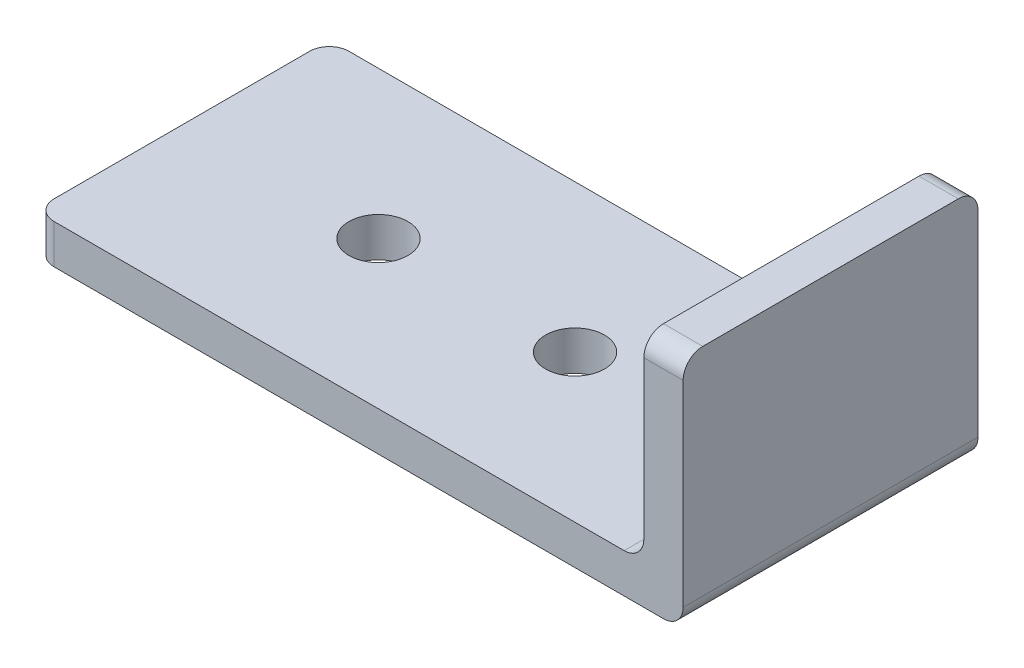
ISO-10303-21;
HEADER;
FILE_DESCRIPTION(('STEP AP214'),'2;1');
FILE_NAME('part.step','',(''),(''),'','','');
FILE_SCHEMA(('AUTOMOTIVE_DESIGN { 1 0 10303 214 1 1 1 1 }'));
ENDSEC;
DATA;
#1=APPLICATION_CONTEXT('core data for automotive mechanical design processes');
#2=APPLICATION_PROTOCOL_DEFINITION('international standard','automotive_design',2000,#1);
#3=PRODUCT_CONTEXT('',#1,'mechanical');
#4=PRODUCT('Part','Part','',(#3));
#5=PRODUCT_RELATED_PRODUCT_CATEGORY('part','',(#4));
#6=PRODUCT_DEFINITION_FORMATION('','',#4);
#7=PRODUCT_DEFINITION_CONTEXT('part definition',#1,'design');
#8=PRODUCT_DEFINITION('design','',#6,#7);
#9=PRODUCT_DEFINITION_SHAPE('','',#8);
#10=(LENGTH_UNIT() NAMED_UNIT(*) SI_UNIT(.MILLI.,.METRE.));
#11=(NAMED_UNIT(*) PLANE_ANGLE_UNIT() SI_UNIT($,.RADIAN.));
#12=(NAMED_UNIT(*) SI_UNIT($,.STERADIAN.) SOLID_ANGLE_UNIT());
#13=UNCERTAINTY_MEASURE_WITH_UNIT(LENGTH_MEASURE(1.E-05),#10,'distance_accuracy_value','');
#14=(GEOMETRIC_REPRESENTATION_CONTEXT(3) GLOBAL_UNCERTAINTY_ASSIGNED_CONTEXT((#13)) GLOBAL_UNIT_ASSIGNED_CONTEXT((#10,
#11,#12)) REPRESENTATION_CONTEXT('',''));
#15=CARTESIAN_POINT('',(0.,0.,0.));
#16=DIRECTION('',(0.,0.,1.));
#17=DIRECTION('',(1.,0.,0.));
#18=AXIS2_PLACEMENT_3D('',#15,#16,#17);
#19=CARTESIAN_POINT('',(0.,2.,-15.));
#20=DIRECTION('',(0.,0.,-1.));
#21=DIRECTION('',(-1.,0.,0.));
#22=AXIS2_PLACEMENT_3D('',#19,#20,#21);
#23=PLANE('',#22);
#24=DIRECTION('',(0.,-1.,0.));
#25=VECTOR('',#24,1.);
#26=CARTESIAN_POINT('',(33.,2.,-15.));
#27=LINE('',#26,#25);
#28=CARTESIAN_POINT('',(33.,11.,-15.));
#29=VERTEX_POINT('',#28);
#30=CARTESIAN_POINT('',(33.,1.,-15.));
#31=VERTEX_POINT('',#30);
#32=EDGE_CURVE('E199',#29,#31,#27,.T.);
#33=ORIENTED_EDGE('',*,*,#32,.T.);
#34=CARTESIAN_POINT('',(32.,1.,-15.));
#35=DIRECTION('',(0.,0.,-1.));
#36=DIRECTION('',(-1.,0.,0.));
#37=AXIS2_PLACEMENT_3D('',#34,#35,#36);
#38=CIRCLE('',#37,1.);
#39=CARTESIAN_POINT('',(32.,0.,-15.));
#40=VERTEX_POINT('',#39);
#41=EDGE_CURVE('E59',#31,#40,#38,.T.);
#42=ORIENTED_EDGE('',*,*,#41,.T.);
#43=DIRECTION('',(1.,0.,0.));
#44=VECTOR('',#43,1.);
#45=CARTESIAN_POINT('',(0.,0.,-15.));
#46=LINE('',#45,#44);
#47=CARTESIAN_POINT('',(1.,0.,-15.));
#48=VERTEX_POINT('',#47);
#49=EDGE_CURVE('E217',#48,#40,#46,.T.);
#50=ORIENTED_EDGE('',*,*,#49,.F.);
#51=DIRECTION('',(0.,-1.,0.));
#52=VECTOR('',#51,1.);
#53=CARTESIAN_POINT('',(1.,2.,-15.));
#54=LINE('',#53,#52);
#55=CARTESIAN_POINT('',(1.,2.,-15.));
#56=VERTEX_POINT('',#55);
#57=EDGE_CURVE('E135',#48,#56,#54,.F.);
#58=ORIENTED_EDGE('',*,*,#57,.T.);
#59=DIRECTION('',(1.,0.,0.));
#60=VECTOR('',#59,1.);
#61=CARTESIAN_POINT('',(0.,2.,-15.));
#62=LINE('',#61,#60);
#63=CARTESIAN_POINT('',(30.,2.,-15.));
#64=VERTEX_POINT('',#63);
#65=EDGE_CURVE('E227',#56,#64,#62,.T.);
#66=ORIENTED_EDGE('',*,*,#65,.T.);
#67=CARTESIAN_POINT('',(30.,3.,-15.));
#68=DIRECTION('',(0.,0.,-1.));
#69=DIRECTION('',(-1.,0.,0.));
#70=AXIS2_PLACEMENT_3D('',#67,#68,#69);
#71=CIRCLE('',#70,1.);
#72=CARTESIAN_POINT('',(31.,3.,-15.));
#73=VERTEX_POINT('',#72);
#74=EDGE_CURVE('E190',#64,#73,#71,.F.);
#75=ORIENTED_EDGE('',*,*,#74,.T.);
#76=DIRECTION('',(0.,-1.,0.));
#77=VECTOR('',#76,1.);
#78=CARTESIAN_POINT('',(31.,12.,-15.));
#79=LINE('',#78,#77);
#80=CARTESIAN_POINT('',(31.,11.,-15.));
#81=VERTEX_POINT('',#80);
#82=EDGE_CURVE('E147',#81,#73,#79,.T.);
#83=ORIENTED_EDGE('',*,*,#82,.F.);
#84=DIRECTION('',(-1.,0.,0.));
#85=VECTOR('',#84,1.);
#86=CARTESIAN_POINT('',(33.,11.,-15.));
#87=LINE('',#86,#85);
#88=EDGE_CURVE('E177',#81,#29,#87,.F.);
#89=ORIENTED_EDGE('',*,*,#88,.T.);
#90=EDGE_LOOP('',(#33,#42,#50,#58,#66,#75,#83,#89));
#91=FACE_BOUND('',#90,.T.);
#92=ADVANCED_FACE('F37',(#91),#23,.T.);
#93=CARTESIAN_POINT('',(0.,2.,0.));
#94=DIRECTION('',(-1.,0.,0.));
#95=DIRECTION('',(0.,0.,1.));
#96=AXIS2_PLACEMENT_3D('',#93,#94,#95);
#97=PLANE('',#96);
#98=DIRECTION('',(0.,0.,-1.));
#99=VECTOR('',#98,1.);
#100=CARTESIAN_POINT('',(0.,0.,0.));
#101=LINE('',#100,#99);
#102=CARTESIAN_POINT('',(0.,0.,-1.));
#103=VERTEX_POINT('',#102);
#104=CARTESIAN_POINT('',(0.,0.,-14.));
#105=VERTEX_POINT('',#104);
#106=EDGE_CURVE('E214',#103,#105,#101,.T.);
#107=ORIENTED_EDGE('',*,*,#106,.F.);
#108=DIRECTION('',(0.,-1.,0.));
#109=VECTOR('',#108,1.);
#110=CARTESIAN_POINT('',(0.,2.,-1.));
#111=LINE('',#110,#109);
#112=CARTESIAN_POINT('',(0.,2.,-1.));
#113=VERTEX_POINT('',#112);
#114=EDGE_CURVE('E186',#103,#113,#111,.F.);
#115=ORIENTED_EDGE('',*,*,#114,.T.);
#116=DIRECTION('',(0.,0.,-1.));
#117=VECTOR('',#116,1.);
#118=CARTESIAN_POINT('',(0.,2.,0.));
#119=LINE('',#118,#117);
#120=CARTESIAN_POINT('',(0.,2.,-14.));
#121=VERTEX_POINT('',#120);
#122=EDGE_CURVE('E208',#113,#121,#119,.T.);
#123=ORIENTED_EDGE('',*,*,#122,.T.);
#124=DIRECTION('',(0.,-1.,0.));
#125=VECTOR('',#124,1.);
#126=CARTESIAN_POINT('',(0.,2.,-14.));
#127=LINE('',#126,#125);
#128=EDGE_CURVE('E183',#121,#105,#127,.T.);
#129=ORIENTED_EDGE('',*,*,#128,.T.);
#130=EDGE_LOOP('',(#107,#115,#123,#129));
#131=FACE_BOUND('',#130,.T.);
#132=ADVANCED_FACE('F263',(#131),#97,.T.);
#133=CARTESIAN_POINT('',(0.,2.,0.));
#134=DIRECTION('',(0.,0.,-1.));
#135=DIRECTION('',(-1.,0.,0.));
#136=AXIS2_PLACEMENT_3D('',#133,#134,#135);
#137=PLANE('',#136);
#138=DIRECTION('',(1.,0.,0.));
#139=VECTOR('',#138,1.);
#140=CARTESIAN_POINT('',(0.,0.,0.));
#141=LINE('',#140,#139);
#142=CARTESIAN_POINT('',(1.,0.,0.));
#143=VERTEX_POINT('',#142);
#144=CARTESIAN_POINT('',(32.,0.,0.));
#145=VERTEX_POINT('',#144);
#146=EDGE_CURVE('E211',#143,#145,#141,.T.);
#147=ORIENTED_EDGE('',*,*,#146,.T.);
#148=CARTESIAN_POINT('',(32.,1.,0.));
#149=DIRECTION('',(0.,0.,-1.));
#150=DIRECTION('',(-1.,0.,0.));
#151=AXIS2_PLACEMENT_3D('',#148,#149,#150);
#152=CIRCLE('',#151,1.);
#153=CARTESIAN_POINT('',(33.,1.,0.));
#154=VERTEX_POINT('',#153);
#155=EDGE_CURVE('E11',#145,#154,#152,.F.);
#156=ORIENTED_EDGE('',*,*,#155,.T.);
#157=DIRECTION('',(0.,-1.,0.));
#158=VECTOR('',#157,1.);
#159=CARTESIAN_POINT('',(33.,2.,0.));
#160=LINE('',#159,#158);
#161=CARTESIAN_POINT('',(33.,11.,0.));
#162=VERTEX_POINT('',#161);
#163=EDGE_CURVE('E132',#162,#154,#160,.T.);
#164=ORIENTED_EDGE('',*,*,#163,.F.);
#165=DIRECTION('',(1.,0.,0.));
#166=VECTOR('',#165,1.);
#167=CARTESIAN_POINT('',(0.,11.,0.));
#168=LINE('',#167,#166);
#169=CARTESIAN_POINT('',(31.,11.,0.));
#170=VERTEX_POINT('',#169);
#171=EDGE_CURVE('E127',#162,#170,#168,.F.);
#172=ORIENTED_EDGE('',*,*,#171,.T.);
#173=DIRECTION('',(0.,-1.,0.));
#174=VECTOR('',#173,1.);
#175=CARTESIAN_POINT('',(31.,12.,0.));
#176=LINE('',#175,#174);
#177=CARTESIAN_POINT('',(31.,3.,0.));
#178=VERTEX_POINT('',#177);
#179=EDGE_CURVE('E130',#170,#178,#176,.T.);
#180=ORIENTED_EDGE('',*,*,#179,.T.);
#181=CARTESIAN_POINT('',(30.,3.,0.));
#182=DIRECTION('',(0.,0.,-1.));
#183=DIRECTION('',(-1.,0.,0.));
#184=AXIS2_PLACEMENT_3D('',#181,#182,#183);
#185=CIRCLE('',#184,1.);
#186=CARTESIAN_POINT('',(30.,2.,0.));
#187=VERTEX_POINT('',#186);
#188=EDGE_CURVE('E188',#178,#187,#185,.T.);
#189=ORIENTED_EDGE('',*,*,#188,.T.);
#190=DIRECTION('',(1.,0.,0.));
#191=VECTOR('',#190,1.);
#192=CARTESIAN_POINT('',(0.,2.,0.));
#193=LINE('',#192,#191);
#194=CARTESIAN_POINT('',(1.,2.,0.));
#195=VERTEX_POINT('',#194);
#196=EDGE_CURVE('E205',#195,#187,#193,.T.);
#197=ORIENTED_EDGE('',*,*,#196,.F.);
#198=DIRECTION('',(0.,-1.,0.));
#199=VECTOR('',#198,1.);
#200=CARTESIAN_POINT('',(1.,0.,0.));
#201=LINE('',#200,#199);
#202=EDGE_CURVE('E136',#195,#143,#201,.T.);
#203=ORIENTED_EDGE('',*,*,#202,.T.);
#204=EDGE_LOOP('',(#147,#156,#164,#172,#180,#189,#197,#203));
#205=FACE_BOUND('',#204,.T.);
#206=ADVANCED_FACE('F129',(#205),#137,.F.);
#207=CARTESIAN_POINT('',(10.,2.,-7.5));
#208=DIRECTION('',(0.,-1.,0.));
#209=DIRECTION('',(0.,0.,-1.));
#210=AXIS2_PLACEMENT_3D('',#207,#208,#209);
#211=CYLINDRICAL_SURFACE('',#210,1.5);
#212=CARTESIAN_POINT('',(10.,2.,-7.5));
#213=DIRECTION('',(0.,1.,0.));
#214=DIRECTION('',(0.,0.,1.));
#215=AXIS2_PLACEMENT_3D('',#212,#213,#214);
#216=CIRCLE('',#215,1.5);
#217=CARTESIAN_POINT('',(10.,2.,-6.));
#218=VERTEX_POINT('',#217);
#219=EDGE_CURVE('E230',#218,#218,#216,.T.);
#220=ORIENTED_EDGE('',*,*,#219,.T.);
#221=EDGE_LOOP('',(#220));
#222=FACE_BOUND('',#221,.T.);
#223=CARTESIAN_POINT('',(10.,0.,-7.5));
#224=DIRECTION('',(0.,1.,0.));
#225=DIRECTION('',(0.,0.,1.));
#226=AXIS2_PLACEMENT_3D('',#223,#224,#225);
#227=CIRCLE('',#226,1.5);
#228=CARTESIAN_POINT('',(10.,0.,-6.));
#229=VERTEX_POINT('',#228);
#230=EDGE_CURVE('E219',#229,#229,#227,.T.);
#231=ORIENTED_EDGE('',*,*,#230,.F.);
#232=EDGE_LOOP('',(#231));
#233=FACE_BOUND('',#232,.T.);
#234=ADVANCED_FACE('F281',(#222,#233),#211,.F.);
#235=CARTESIAN_POINT('',(20.,2.,-7.5));
#236=DIRECTION('',(0.,-1.,0.));
#237=DIRECTION('',(0.,0.,-1.));
#238=AXIS2_PLACEMENT_3D('',#235,#236,#237);
#239=CYLINDRICAL_SURFACE('',#238,1.5);
#240=CARTESIAN_POINT('',(20.,2.,-7.5));
#241=DIRECTION('',(0.,1.,0.));
#242=DIRECTION('',(0.,0.,1.));
#243=AXIS2_PLACEMENT_3D('',#240,#241,#242);
#244=CIRCLE('',#243,1.5);
#245=CARTESIAN_POINT('',(20.,2.,-6.));
#246=VERTEX_POINT('',#245);
#247=EDGE_CURVE('E213',#246,#246,#244,.T.);
#248=ORIENTED_EDGE('',*,*,#247,.T.);
#249=EDGE_LOOP('',(#248));
#250=FACE_BOUND('',#249,.T.);
#251=CARTESIAN_POINT('',(20.,0.,-7.5));
#252=DIRECTION('',(0.,1.,0.));
#253=DIRECTION('',(0.,0.,1.));
#254=AXIS2_PLACEMENT_3D('',#251,#252,#253);
#255=CIRCLE('',#254,1.5);
#256=CARTESIAN_POINT('',(20.,0.,-6.));
#257=VERTEX_POINT('',#256);
#258=EDGE_CURVE('E222',#257,#257,#255,.T.);
#259=ORIENTED_EDGE('',*,*,#258,.F.);
#260=EDGE_LOOP('',(#259));
#261=FACE_BOUND('',#260,.T.);
#262=ADVANCED_FACE('F284',(#250,#261),#239,.F.);
#263=CARTESIAN_POINT('',(33.,2.,0.));
#264=DIRECTION('',(-1.,0.,0.));
#265=DIRECTION('',(0.,0.,1.));
#266=AXIS2_PLACEMENT_3D('',#263,#264,#265);
#267=PLANE('',#266);
#268=ORIENTED_EDGE('',*,*,#163,.T.);
#269=DIRECTION('',(0.,0.,-1.));
#270=VECTOR('',#269,1.);
#271=CARTESIAN_POINT('',(33.,1.,0.));
#272=LINE('',#271,#270);
#273=EDGE_CURVE('E192',#154,#31,#272,.T.);
#274=ORIENTED_EDGE('',*,*,#273,.T.);
#275=ORIENTED_EDGE('',*,*,#32,.F.);
#276=CARTESIAN_POINT('',(33.,11.,-14.));
#277=DIRECTION('',(-1.,0.,0.));
#278=DIRECTION('',(0.,0.,1.));
#279=AXIS2_PLACEMENT_3D('',#276,#277,#278);
#280=CIRCLE('',#279,1.);
#281=CARTESIAN_POINT('',(33.,12.,-14.));
#282=VERTEX_POINT('',#281);
#283=EDGE_CURVE('E170',#29,#282,#280,.F.);
#284=ORIENTED_EDGE('',*,*,#283,.T.);
#285=DIRECTION('',(0.,0.,-1.));
#286=VECTOR('',#285,1.);
#287=CARTESIAN_POINT('',(33.,12.,-15.));
#288=LINE('',#287,#286);
#289=CARTESIAN_POINT('',(33.,12.,-1.));
#290=VERTEX_POINT('',#289);
#291=EDGE_CURVE('E237',#290,#282,#288,.T.);
#292=ORIENTED_EDGE('',*,*,#291,.F.);
#293=CARTESIAN_POINT('',(33.,11.,-1.));
#294=DIRECTION('',(-1.,0.,0.));
#295=DIRECTION('',(0.,0.,1.));
#296=AXIS2_PLACEMENT_3D('',#293,#294,#295);
#297=CIRCLE('',#296,1.);
#298=EDGE_CURVE('E172',#290,#162,#297,.F.);
#299=ORIENTED_EDGE('',*,*,#298,.T.);
#300=EDGE_LOOP('',(#268,#274,#275,#284,#292,#299));
#301=FACE_BOUND('',#300,.T.);
#302=ADVANCED_FACE('F198',(#301),#267,.F.);
#303=CARTESIAN_POINT('',(0.,2.,0.));
#304=DIRECTION('',(0.,1.,0.));
#305=DIRECTION('',(0.,0.,1.));
#306=AXIS2_PLACEMENT_3D('',#303,#304,#305);
#307=PLANE('',#306);
#308=ORIENTED_EDGE('',*,*,#196,.T.);
#309=DIRECTION('',(0.,0.,1.));
#310=VECTOR('',#309,1.);
#311=CARTESIAN_POINT('',(30.,2.,0.));
#312=LINE('',#311,#310);
#313=EDGE_CURVE('E164',#187,#64,#312,.F.);
#314=ORIENTED_EDGE('',*,*,#313,.T.);
#315=ORIENTED_EDGE('',*,*,#65,.F.);
#316=CARTESIAN_POINT('',(1.,2.,-14.));
#317=DIRECTION('',(0.,1.,0.));
#318=DIRECTION('',(0.,0.,1.));
#319=AXIS2_PLACEMENT_3D('',#316,#317,#318);
#320=CIRCLE('',#319,1.);
#321=EDGE_CURVE('E156',#56,#121,#320,.T.);
#322=ORIENTED_EDGE('',*,*,#321,.T.);
#323=ORIENTED_EDGE('',*,*,#122,.F.);
#324=CARTESIAN_POINT('',(1.,2.,-1.));
#325=DIRECTION('',(0.,1.,0.));
#326=DIRECTION('',(0.,0.,1.));
#327=AXIS2_PLACEMENT_3D('',#324,#325,#326);
#328=CIRCLE('',#327,1.);
#329=EDGE_CURVE('E162',#113,#195,#328,.T.);
#330=ORIENTED_EDGE('',*,*,#329,.T.);
#331=EDGE_LOOP('',(#308,#314,#315,#322,#323,#330));
#332=FACE_BOUND('',#331,.T.);
#333=ORIENTED_EDGE('',*,*,#247,.F.);
#334=EDGE_LOOP('',(#333));
#335=FACE_BOUND('',#334,.T.);
#336=ORIENTED_EDGE('',*,*,#219,.F.);
#337=EDGE_LOOP('',(#336));
#338=FACE_BOUND('',#337,.T.);
#339=ADVANCED_FACE('F253',(#332,#335,#338),#307,.T.);
#340=CARTESIAN_POINT('',(0.,0.,0.));
#341=DIRECTION('',(0.,1.,0.));
#342=DIRECTION('',(0.,0.,1.));
#343=AXIS2_PLACEMENT_3D('',#340,#341,#342);
#344=PLANE('',#343);
#345=ORIENTED_EDGE('',*,*,#258,.T.);
#346=EDGE_LOOP('',(#345));
#347=FACE_BOUND('',#346,.T.);
#348=ORIENTED_EDGE('',*,*,#230,.T.);
#349=EDGE_LOOP('',(#348));
#350=FACE_BOUND('',#349,.T.);
#351=ORIENTED_EDGE('',*,*,#49,.T.);
#352=DIRECTION('',(0.,0.,-1.));
#353=VECTOR('',#352,1.);
#354=CARTESIAN_POINT('',(32.,0.,0.));
#355=LINE('',#354,#353);
#356=EDGE_CURVE('E45',#40,#145,#355,.F.);
#357=ORIENTED_EDGE('',*,*,#356,.T.);
#358=ORIENTED_EDGE('',*,*,#146,.F.);
#359=CARTESIAN_POINT('',(1.,0.,-1.));
#360=DIRECTION('',(0.,1.,0.));
#361=DIRECTION('',(0.,0.,1.));
#362=AXIS2_PLACEMENT_3D('',#359,#360,#361);
#363=CIRCLE('',#362,1.);
#364=EDGE_CURVE('E181',#143,#103,#363,.F.);
#365=ORIENTED_EDGE('',*,*,#364,.T.);
#366=ORIENTED_EDGE('',*,*,#106,.T.);
#367=CARTESIAN_POINT('',(1.,0.,-14.));
#368=DIRECTION('',(0.,1.,0.));
#369=DIRECTION('',(0.,0.,1.));
#370=AXIS2_PLACEMENT_3D('',#367,#368,#369);
#371=CIRCLE('',#370,1.);
#372=EDGE_CURVE('E179',#105,#48,#371,.F.);
#373=ORIENTED_EDGE('',*,*,#372,.T.);
#374=EDGE_LOOP('',(#351,#357,#358,#365,#366,#373));
#375=FACE_BOUND('',#374,.T.);
#376=ADVANCED_FACE('F260',(#347,#350,#375),#344,.F.);
#377=CARTESIAN_POINT('',(31.,12.,-15.));
#378=DIRECTION('',(1.,0.,0.));
#379=DIRECTION('',(0.,0.,-1.));
#380=AXIS2_PLACEMENT_3D('',#377,#378,#379);
#381=PLANE('',#380);
#382=ORIENTED_EDGE('',*,*,#82,.T.);
#383=DIRECTION('',(0.,0.,1.));
#384=VECTOR('',#383,1.);
#385=CARTESIAN_POINT('',(31.,3.,-15.));
#386=LINE('',#385,#384);
#387=EDGE_CURVE('E146',#73,#178,#386,.T.);
#388=ORIENTED_EDGE('',*,*,#387,.T.);
#389=ORIENTED_EDGE('',*,*,#179,.F.);
#390=CARTESIAN_POINT('',(31.,11.,-1.));
#391=DIRECTION('',(1.,0.,0.));
#392=DIRECTION('',(0.,0.,-1.));
#393=AXIS2_PLACEMENT_3D('',#390,#391,#392);
#394=CIRCLE('',#393,1.);
#395=CARTESIAN_POINT('',(31.,12.,-1.));
#396=VERTEX_POINT('',#395);
#397=EDGE_CURVE('E143',#170,#396,#394,.F.);
#398=ORIENTED_EDGE('',*,*,#397,.T.);
#399=DIRECTION('',(0.,0.,1.));
#400=VECTOR('',#399,1.);
#401=CARTESIAN_POINT('',(31.,12.,-15.));
#402=LINE('',#401,#400);
#403=CARTESIAN_POINT('',(31.,12.,-14.));
#404=VERTEX_POINT('',#403);
#405=EDGE_CURVE('E148',#404,#396,#402,.T.);
#406=ORIENTED_EDGE('',*,*,#405,.F.);
#407=CARTESIAN_POINT('',(31.,11.,-14.));
#408=DIRECTION('',(1.,0.,0.));
#409=DIRECTION('',(0.,0.,-1.));
#410=AXIS2_PLACEMENT_3D('',#407,#408,#409);
#411=CIRCLE('',#410,1.);
#412=EDGE_CURVE('E154',#404,#81,#411,.F.);
#413=ORIENTED_EDGE('',*,*,#412,.T.);
#414=EDGE_LOOP('',(#382,#388,#389,#398,#406,#413));
#415=FACE_BOUND('',#414,.T.);
#416=ADVANCED_FACE('F141',(#415),#381,.F.);
#417=CARTESIAN_POINT('',(0.,12.,0.));
#418=DIRECTION('',(0.,-1.,0.));
#419=DIRECTION('',(0.,0.,-1.));
#420=AXIS2_PLACEMENT_3D('',#417,#418,#419);
#421=PLANE('',#420);
#422=ORIENTED_EDGE('',*,*,#405,.T.);
#423=DIRECTION('',(1.,0.,0.));
#424=VECTOR('',#423,1.);
#425=CARTESIAN_POINT('',(0.,12.,-1.));
#426=LINE('',#425,#424);
#427=EDGE_CURVE('E153',#396,#290,#426,.T.);
#428=ORIENTED_EDGE('',*,*,#427,.T.);
#429=ORIENTED_EDGE('',*,*,#291,.T.);
#430=DIRECTION('',(-1.,0.,0.));
#431=VECTOR('',#430,1.);
#432=CARTESIAN_POINT('',(31.,12.,-14.));
#433=LINE('',#432,#431);
#434=EDGE_CURVE('E166',#282,#404,#433,.T.);
#435=ORIENTED_EDGE('',*,*,#434,.T.);
#436=EDGE_LOOP('',(#422,#428,#429,#435));
#437=FACE_BOUND('',#436,.T.);
#438=ADVANCED_FACE('F242',(#437),#421,.F.);
#439=CARTESIAN_POINT('',(30.,3.,-15.));
#440=DIRECTION('',(0.,0.,1.));
#441=DIRECTION('',(1.,0.,0.));
#442=AXIS2_PLACEMENT_3D('',#439,#440,#441);
#443=CYLINDRICAL_SURFACE('',#442,1.);
#444=ORIENTED_EDGE('',*,*,#74,.F.);
#445=ORIENTED_EDGE('',*,*,#313,.F.);
#446=ORIENTED_EDGE('',*,*,#188,.F.);
#447=ORIENTED_EDGE('',*,*,#387,.F.);
#448=EDGE_LOOP('',(#444,#445,#446,#447));
#449=FACE_BOUND('',#448,.T.);
#450=ADVANCED_FACE('F249',(#449),#443,.F.);
#451=CARTESIAN_POINT('',(0.,11.,-1.));
#452=DIRECTION('',(1.,0.,0.));
#453=DIRECTION('',(0.,0.,-1.));
#454=AXIS2_PLACEMENT_3D('',#451,#452,#453);
#455=CYLINDRICAL_SURFACE('',#454,1.);
#456=ORIENTED_EDGE('',*,*,#397,.F.);
#457=ORIENTED_EDGE('',*,*,#171,.F.);
#458=ORIENTED_EDGE('',*,*,#298,.F.);
#459=ORIENTED_EDGE('',*,*,#427,.F.);
#460=EDGE_LOOP('',(#456,#457,#458,#459));
#461=FACE_BOUND('',#460,.T.);
#462=ADVANCED_FACE('F151',(#461),#455,.T.);
#463=CARTESIAN_POINT('',(0.,11.,-14.));
#464=DIRECTION('',(1.,0.,0.));
#465=DIRECTION('',(0.,0.,-1.));
#466=AXIS2_PLACEMENT_3D('',#463,#464,#465);
#467=CYLINDRICAL_SURFACE('',#466,1.);
#468=ORIENTED_EDGE('',*,*,#283,.F.);
#469=ORIENTED_EDGE('',*,*,#88,.F.);
#470=ORIENTED_EDGE('',*,*,#412,.F.);
#471=ORIENTED_EDGE('',*,*,#434,.F.);
#472=EDGE_LOOP('',(#468,#469,#470,#471));
#473=FACE_BOUND('',#472,.T.);
#474=ADVANCED_FACE('F244',(#473),#467,.T.);
#475=CARTESIAN_POINT('',(1.,2.,-1.));
#476=DIRECTION('',(0.,1.,0.));
#477=DIRECTION('',(0.,0.,1.));
#478=AXIS2_PLACEMENT_3D('',#475,#476,#477);
#479=CYLINDRICAL_SURFACE('',#478,1.);
#480=ORIENTED_EDGE('',*,*,#329,.F.);
#481=ORIENTED_EDGE('',*,*,#114,.F.);
#482=ORIENTED_EDGE('',*,*,#364,.F.);
#483=ORIENTED_EDGE('',*,*,#202,.F.);
#484=EDGE_LOOP('',(#480,#481,#482,#483));
#485=FACE_BOUND('',#484,.T.);
#486=ADVANCED_FACE('F259',(#485),#479,.T.);
#487=CARTESIAN_POINT('',(1.,2.,-14.));
#488=DIRECTION('',(0.,-1.,0.));
#489=DIRECTION('',(0.,0.,-1.));
#490=AXIS2_PLACEMENT_3D('',#487,#488,#489);
#491=CYLINDRICAL_SURFACE('',#490,1.);
#492=ORIENTED_EDGE('',*,*,#321,.F.);
#493=ORIENTED_EDGE('',*,*,#57,.F.);
#494=ORIENTED_EDGE('',*,*,#372,.F.);
#495=ORIENTED_EDGE('',*,*,#128,.F.);
#496=EDGE_LOOP('',(#492,#493,#494,#495));
#497=FACE_BOUND('',#496,.T.);
#498=ADVANCED_FACE('F267',(#497),#491,.T.);
#499=CARTESIAN_POINT('',(32.,1.,0.));
#500=DIRECTION('',(0.,0.,-1.));
#501=DIRECTION('',(-1.,0.,0.));
#502=AXIS2_PLACEMENT_3D('',#499,#500,#501);
#503=CYLINDRICAL_SURFACE('',#502,1.);
#504=ORIENTED_EDGE('',*,*,#155,.F.);
#505=ORIENTED_EDGE('',*,*,#356,.F.);
#506=ORIENTED_EDGE('',*,*,#41,.F.);
#507=ORIENTED_EDGE('',*,*,#273,.F.);
#508=EDGE_LOOP('',(#504,#505,#506,#507));
#509=FACE_BOUND('',#508,.T.);
#510=ADVANCED_FACE('F39',(#509),#503,.T.);
#511=CLOSED_SHELL('',(#92,#132,#206,#234,#262,#302,#339,#376,#416,#438,#450,#462,#474,#486,#498,#510));
#512=MANIFOLD_SOLID_BREP('B2',#511);
#513=ADVANCED_BREP_SHAPE_REPRESENTATION('',(#18,#512),#14);
#514=SHAPE_DEFINITION_REPRESENTATION(#9,#513);
ENDSEC;
END-ISO-10303-21;
